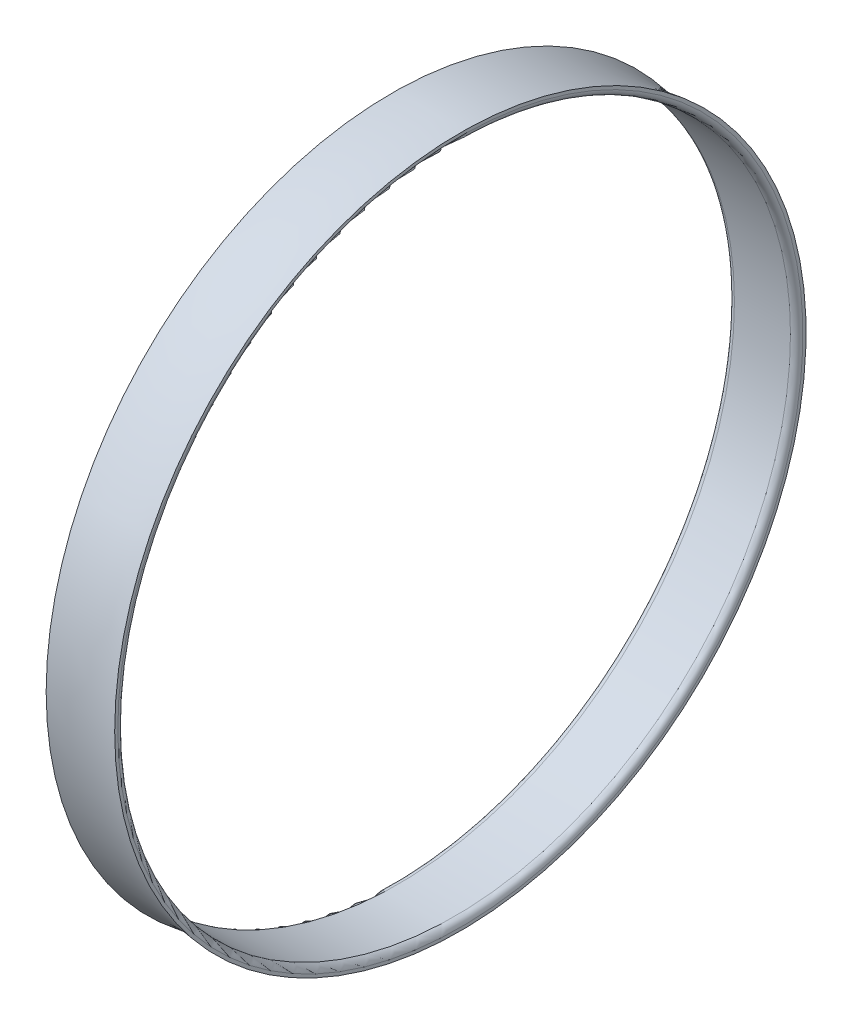
ISO-10303-21;
HEADER;
FILE_DESCRIPTION(('STEP AP214'),'2;1');
FILE_NAME('part.step','',(''),(''),'','','');
FILE_SCHEMA(('AUTOMOTIVE_DESIGN { 1 0 10303 214 1 1 1 1 }'));
ENDSEC;
DATA;
#1=APPLICATION_CONTEXT('core data for automotive mechanical design processes');
#2=APPLICATION_PROTOCOL_DEFINITION('international standard','automotive_design',2000,#1);
#3=PRODUCT_CONTEXT('',#1,'mechanical');
#4=PRODUCT('Part','Part','',(#3));
#5=PRODUCT_RELATED_PRODUCT_CATEGORY('part','',(#4));
#6=PRODUCT_DEFINITION_FORMATION('','',#4);
#7=PRODUCT_DEFINITION_CONTEXT('part definition',#1,'design');
#8=PRODUCT_DEFINITION('design','',#6,#7);
#9=PRODUCT_DEFINITION_SHAPE('','',#8);
#10=(LENGTH_UNIT() NAMED_UNIT(*) SI_UNIT(.MILLI.,.METRE.));
#11=(NAMED_UNIT(*) PLANE_ANGLE_UNIT() SI_UNIT($,.RADIAN.));
#12=(NAMED_UNIT(*) SI_UNIT($,.STERADIAN.) SOLID_ANGLE_UNIT());
#13=UNCERTAINTY_MEASURE_WITH_UNIT(LENGTH_MEASURE(1.E-05),#10,'distance_accuracy_value','');
#14=(GEOMETRIC_REPRESENTATION_CONTEXT(3) GLOBAL_UNCERTAINTY_ASSIGNED_CONTEXT((#13)) GLOBAL_UNIT_ASSIGNED_CONTEXT((#10,
#11,#12)) REPRESENTATION_CONTEXT('',''));
#15=CARTESIAN_POINT('',(0.,0.,0.));
#16=DIRECTION('',(0.,0.,1.));
#17=DIRECTION('',(1.,0.,0.));
#18=AXIS2_PLACEMENT_3D('',#15,#16,#17);
#19=CARTESIAN_POINT('',(10.2855703619102,0.,0.));
#20=DIRECTION('',(-1.,0.,0.));
#21=DIRECTION('',(0.,0.,1.));
#22=AXIS2_PLACEMENT_3D('',#19,#20,#21);
#23=TOROIDAL_SURFACE('',#22,84.9915242061173,30.);
#24=CARTESIAN_POINT('',(4.78557036191016,0.,0.));
#25=DIRECTION('',(-1.,0.,0.));
#26=DIRECTION('',(0.,0.,1.));
#27=AXIS2_PLACEMENT_3D('',#24,#25,#26);
#28=CIRCLE('',#27,55.5);
#29=CARTESIAN_POINT('',(4.78557036191016,0.,55.5));
#30=VERTEX_POINT('',#29);
#31=EDGE_CURVE('E54',#30,#30,#28,.T.);
#32=ORIENTED_EDGE('',*,*,#31,.F.);
#33=EDGE_LOOP('',(#32));
#34=FACE_BOUND('',#33,.T.);
#35=CARTESIAN_POINT('',(15.7855703619101,0.,0.));
#36=DIRECTION('',(-1.,0.,0.));
#37=DIRECTION('',(0.,0.,1.));
#38=AXIS2_PLACEMENT_3D('',#35,#36,#37);
#39=CIRCLE('',#38,55.5);
#40=CARTESIAN_POINT('',(15.7855703619101,0.,55.5));
#41=VERTEX_POINT('',#40);
#42=EDGE_CURVE('E10',#41,#41,#39,.T.);
#43=ORIENTED_EDGE('',*,*,#42,.T.);
#44=EDGE_LOOP('',(#43));
#45=FACE_BOUND('',#44,.T.);
#46=ADVANCED_FACE('F32',(#34,#45),#23,.F.);
#47=CARTESIAN_POINT('',(15.7855703619102,55.5,0.));
#48=DIRECTION('',(-1.,0.,0.));
#49=DIRECTION('',(0.,0.,1.));
#50=AXIS2_PLACEMENT_3D('',#47,#48,#49);
#51=PLANE('',#50);
#52=ORIENTED_EDGE('',*,*,#42,.F.);
#53=EDGE_LOOP('',(#52));
#54=FACE_BOUND('',#53,.T.);
#55=CARTESIAN_POINT('',(15.7855703619102,0.,0.));
#56=DIRECTION('',(-1.,0.,0.));
#57=DIRECTION('',(0.,0.,1.));
#58=AXIS2_PLACEMENT_3D('',#55,#56,#57);
#59=CIRCLE('',#58,54.9972255364846);
#60=CARTESIAN_POINT('',(15.7855703619102,0.,54.9972255364846));
#61=VERTEX_POINT('',#60);
#62=EDGE_CURVE('E38',#61,#61,#59,.T.);
#63=ORIENTED_EDGE('',*,*,#62,.T.);
#64=EDGE_LOOP('',(#63));
#65=FACE_BOUND('',#64,.T.);
#66=ADVANCED_FACE('F61',(#54,#65),#51,.F.);
#67=CARTESIAN_POINT('',(14.7855703619102,0.,0.));
#68=DIRECTION('',(-1.,0.,0.));
#69=DIRECTION('',(0.,0.,1.));
#70=AXIS2_PLACEMENT_3D('',#67,#68,#69);
#71=TOROIDAL_SURFACE('',#70,54.9972255364846,1.);
#72=ORIENTED_EDGE('',*,*,#62,.F.);
#73=EDGE_LOOP('',(#72));
#74=FACE_BOUND('',#73,.T.);
#75=CARTESIAN_POINT('',(14.7855703619102,0.,0.));
#76=DIRECTION('',(-1.,0.,0.));
#77=DIRECTION('',(0.,0.,1.));
#78=AXIS2_PLACEMENT_3D('',#75,#76,#77);
#79=CIRCLE('',#78,53.9972255364846);
#80=CARTESIAN_POINT('',(14.7855703619102,0.,53.9972255364846));
#81=VERTEX_POINT('',#80);
#82=EDGE_CURVE('E42',#81,#81,#79,.T.);
#83=ORIENTED_EDGE('',*,*,#82,.T.);
#84=EDGE_LOOP('',(#83));
#85=FACE_BOUND('',#84,.T.);
#86=ADVANCED_FACE('F65',(#74,#85),#71,.T.);
#87=CARTESIAN_POINT('',(-59.6339304289586,0.,0.));
#88=DIRECTION('',(-1.,0.,0.));
#89=DIRECTION('',(0.,0.,1.));
#90=AXIS2_PLACEMENT_3D('',#87,#88,#89);
#91=CYLINDRICAL_SURFACE('',#90,53.9972255364846);
#92=ORIENTED_EDGE('',*,*,#82,.F.);
#93=EDGE_LOOP('',(#92));
#94=FACE_BOUND('',#93,.T.);
#95=CARTESIAN_POINT('',(5.78557036191016,0.,0.));
#96=DIRECTION('',(-1.,0.,0.));
#97=DIRECTION('',(0.,0.,1.));
#98=AXIS2_PLACEMENT_3D('',#95,#96,#97);
#99=CIRCLE('',#98,53.9972255364846);
#100=CARTESIAN_POINT('',(5.78557036191016,0.,53.9972255364846));
#101=VERTEX_POINT('',#100);
#102=EDGE_CURVE('E46',#101,#101,#99,.T.);
#103=ORIENTED_EDGE('',*,*,#102,.T.);
#104=EDGE_LOOP('',(#103));
#105=FACE_BOUND('',#104,.T.);
#106=ADVANCED_FACE('F70',(#94,#105),#91,.F.);
#107=CARTESIAN_POINT('',(5.78557036191015,0.,0.));
#108=DIRECTION('',(-1.,0.,0.));
#109=DIRECTION('',(0.,0.,1.));
#110=AXIS2_PLACEMENT_3D('',#107,#108,#109);
#111=TOROIDAL_SURFACE('',#110,54.9972255364846,1.00000000000001);
#112=ORIENTED_EDGE('',*,*,#102,.F.);
#113=EDGE_LOOP('',(#112));
#114=FACE_BOUND('',#113,.T.);
#115=CARTESIAN_POINT('',(4.78557036191014,0.,0.));
#116=DIRECTION('',(-1.,0.,0.));
#117=DIRECTION('',(0.,0.,1.));
#118=AXIS2_PLACEMENT_3D('',#115,#116,#117);
#119=CIRCLE('',#118,54.9972255364846);
#120=CARTESIAN_POINT('',(4.78557036191014,0.,54.9972255364846));
#121=VERTEX_POINT('',#120);
#122=EDGE_CURVE('E51',#121,#121,#119,.T.);
#123=ORIENTED_EDGE('',*,*,#122,.T.);
#124=EDGE_LOOP('',(#123));
#125=FACE_BOUND('',#124,.T.);
#126=ADVANCED_FACE('F76',(#114,#125),#111,.T.);
#127=CARTESIAN_POINT('',(4.78557036191015,55.5,0.));
#128=DIRECTION('',(1.,0.,0.));
#129=DIRECTION('',(0.,0.,-1.));
#130=AXIS2_PLACEMENT_3D('',#127,#128,#129);
#131=PLANE('',#130);
#132=ORIENTED_EDGE('',*,*,#122,.F.);
#133=EDGE_LOOP('',(#132));
#134=FACE_BOUND('',#133,.T.);
#135=ORIENTED_EDGE('',*,*,#31,.T.);
#136=EDGE_LOOP('',(#135));
#137=FACE_BOUND('',#136,.T.);
#138=ADVANCED_FACE('F58',(#134,#137),#131,.F.);
#139=CLOSED_SHELL('',(#46,#66,#86,#106,#126,#138));
#140=MANIFOLD_SOLID_BREP('B2',#139);
#141=ADVANCED_BREP_SHAPE_REPRESENTATION('',(#18,#140),#14);
#142=SHAPE_DEFINITION_REPRESENTATION(#9,#141);
ENDSEC;
END-ISO-10303-21;
